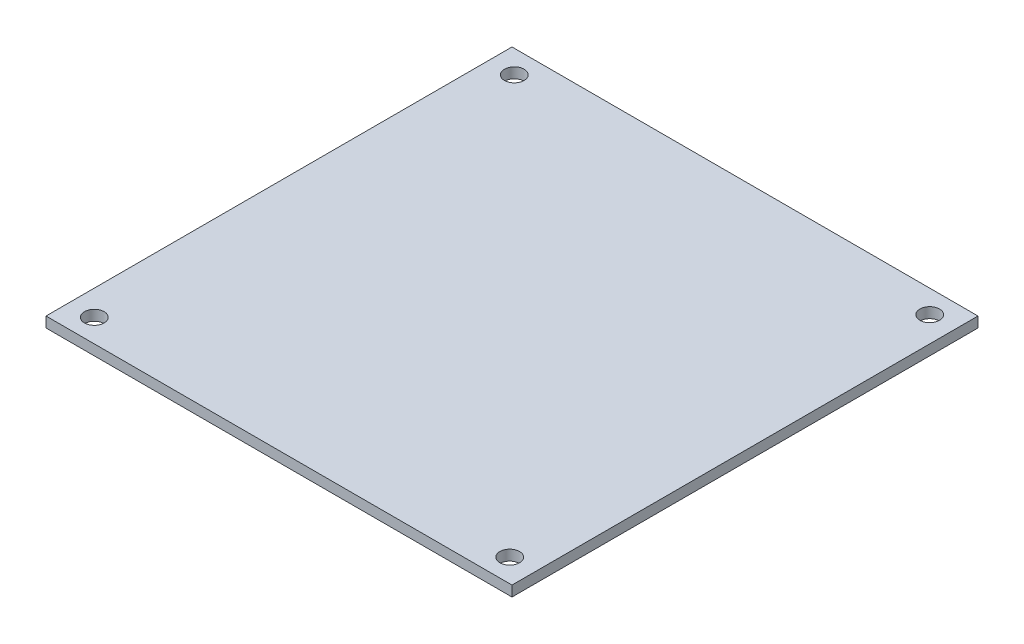
ISO-10303-21;
HEADER;
FILE_DESCRIPTION(('STEP AP214'),'2;1');
FILE_NAME('part.step','',(''),(''),'','','');
FILE_SCHEMA(('AUTOMOTIVE_DESIGN { 1 0 10303 214 1 1 1 1 }'));
ENDSEC;
DATA;
#1=APPLICATION_CONTEXT('core data for automotive mechanical design processes');
#2=APPLICATION_PROTOCOL_DEFINITION('international standard','automotive_design',2000,#1);
#3=PRODUCT_CONTEXT('',#1,'mechanical');
#4=PRODUCT('Part','Part','',(#3));
#5=PRODUCT_RELATED_PRODUCT_CATEGORY('part','',(#4));
#6=PRODUCT_DEFINITION_FORMATION('','',#4);
#7=PRODUCT_DEFINITION_CONTEXT('part definition',#1,'design');
#8=PRODUCT_DEFINITION('design','',#6,#7);
#9=PRODUCT_DEFINITION_SHAPE('','',#8);
#10=(LENGTH_UNIT() NAMED_UNIT(*) SI_UNIT(.MILLI.,.METRE.));
#11=(NAMED_UNIT(*) PLANE_ANGLE_UNIT() SI_UNIT($,.RADIAN.));
#12=(NAMED_UNIT(*) SI_UNIT($,.STERADIAN.) SOLID_ANGLE_UNIT());
#13=UNCERTAINTY_MEASURE_WITH_UNIT(LENGTH_MEASURE(1.E-05),#10,'distance_accuracy_value','');
#14=(GEOMETRIC_REPRESENTATION_CONTEXT(3) GLOBAL_UNCERTAINTY_ASSIGNED_CONTEXT((#13)) GLOBAL_UNIT_ASSIGNED_CONTEXT((#10,
#11,#12)) REPRESENTATION_CONTEXT('',''));
#15=CARTESIAN_POINT('',(0.,0.,0.));
#16=DIRECTION('',(0.,0.,1.));
#17=DIRECTION('',(1.,0.,0.));
#18=AXIS2_PLACEMENT_3D('',#15,#16,#17);
#19=CARTESIAN_POINT('',(35.56,1.5875,35.56));
#20=DIRECTION('',(0.,1.,0.));
#21=DIRECTION('',(0.,0.,1.));
#22=AXIS2_PLACEMENT_3D('',#19,#20,#21);
#23=PLANE('',#22);
#24=CARTESIAN_POINT('',(31.7,1.5875,32.05));
#25=DIRECTION('',(0.,1.,0.));
#26=DIRECTION('',(0.,0.,1.));
#27=AXIS2_PLACEMENT_3D('',#24,#25,#26);
#28=CIRCLE('',#27,1.5);
#29=CARTESIAN_POINT('',(31.7,1.5875,33.55));
#30=VERTEX_POINT('',#29);
#31=EDGE_CURVE('E120',#30,#30,#28,.T.);
#32=ORIENTED_EDGE('',*,*,#31,.F.);
#33=EDGE_LOOP('',(#32));
#34=FACE_BOUND('',#33,.T.);
#35=CARTESIAN_POINT('',(-31.7,1.5875,-32.05));
#36=DIRECTION('',(0.,1.,0.));
#37=DIRECTION('',(0.,0.,1.));
#38=AXIS2_PLACEMENT_3D('',#35,#36,#37);
#39=CIRCLE('',#38,1.5);
#40=CARTESIAN_POINT('',(-31.7,1.5875,-30.55));
#41=VERTEX_POINT('',#40);
#42=EDGE_CURVE('E99',#41,#41,#39,.T.);
#43=ORIENTED_EDGE('',*,*,#42,.F.);
#44=EDGE_LOOP('',(#43));
#45=FACE_BOUND('',#44,.T.);
#46=DIRECTION('',(0.,0.,-1.));
#47=VECTOR('',#46,1.);
#48=CARTESIAN_POINT('',(35.56,1.5875,-35.56));
#49=LINE('',#48,#47);
#50=CARTESIAN_POINT('',(35.56,1.5875,35.56));
#51=VERTEX_POINT('',#50);
#52=CARTESIAN_POINT('',(35.56,1.5875,-35.56));
#53=VERTEX_POINT('',#52);
#54=EDGE_CURVE('E84',#51,#53,#49,.T.);
#55=ORIENTED_EDGE('',*,*,#54,.T.);
#56=DIRECTION('',(-1.,0.,0.));
#57=VECTOR('',#56,1.);
#58=CARTESIAN_POINT('',(-35.56,1.5875,-35.56));
#59=LINE('',#58,#57);
#60=CARTESIAN_POINT('',(-35.56,1.5875,-35.56));
#61=VERTEX_POINT('',#60);
#62=EDGE_CURVE('E79',#53,#61,#59,.T.);
#63=ORIENTED_EDGE('',*,*,#62,.T.);
#64=DIRECTION('',(0.,0.,1.));
#65=VECTOR('',#64,1.);
#66=CARTESIAN_POINT('',(-35.56,1.5875,-35.56));
#67=LINE('',#66,#65);
#68=CARTESIAN_POINT('',(-35.56,1.5875,35.56));
#69=VERTEX_POINT('',#68);
#70=EDGE_CURVE('E82',#61,#69,#67,.T.);
#71=ORIENTED_EDGE('',*,*,#70,.T.);
#72=DIRECTION('',(1.,0.,0.));
#73=VECTOR('',#72,1.);
#74=CARTESIAN_POINT('',(-35.56,1.5875,35.56));
#75=LINE('',#74,#73);
#76=EDGE_CURVE('E49',#69,#51,#75,.T.);
#77=ORIENTED_EDGE('',*,*,#76,.T.);
#78=EDGE_LOOP('',(#55,#63,#71,#77));
#79=FACE_BOUND('',#78,.T.);
#80=CARTESIAN_POINT('',(31.7,1.5875,-32.05));
#81=DIRECTION('',(0.,1.,0.));
#82=DIRECTION('',(0.,0.,-1.));
#83=AXIS2_PLACEMENT_3D('',#80,#81,#82);
#84=CIRCLE('',#83,1.5);
#85=CARTESIAN_POINT('',(31.7,1.5875,-33.55));
#86=VERTEX_POINT('',#85);
#87=EDGE_CURVE('E114',#86,#86,#84,.T.);
#88=ORIENTED_EDGE('',*,*,#87,.F.);
#89=EDGE_LOOP('',(#88));
#90=FACE_BOUND('',#89,.T.);
#91=CARTESIAN_POINT('',(-31.7,1.5875,32.05));
#92=DIRECTION('',(0.,1.,0.));
#93=DIRECTION('',(0.,0.,-1.));
#94=AXIS2_PLACEMENT_3D('',#91,#92,#93);
#95=CIRCLE('',#94,1.5);
#96=CARTESIAN_POINT('',(-31.7,1.5875,30.55));
#97=VERTEX_POINT('',#96);
#98=EDGE_CURVE('E126',#97,#97,#95,.T.);
#99=ORIENTED_EDGE('',*,*,#98,.F.);
#100=EDGE_LOOP('',(#99));
#101=FACE_BOUND('',#100,.T.);
#102=ADVANCED_FACE('F32',(#34,#45,#79,#90,#101),#23,.T.);
#103=CARTESIAN_POINT('',(35.56,0.,35.56));
#104=DIRECTION('',(0.,1.,0.));
#105=DIRECTION('',(0.,0.,1.));
#106=AXIS2_PLACEMENT_3D('',#103,#104,#105);
#107=PLANE('',#106);
#108=CARTESIAN_POINT('',(31.7,0.,32.05));
#109=DIRECTION('',(0.,1.,0.));
#110=DIRECTION('',(0.,0.,1.));
#111=AXIS2_PLACEMENT_3D('',#108,#109,#110);
#112=CIRCLE('',#111,1.5);
#113=CARTESIAN_POINT('',(31.7,0.,33.55));
#114=VERTEX_POINT('',#113);
#115=EDGE_CURVE('E123',#114,#114,#112,.T.);
#116=ORIENTED_EDGE('',*,*,#115,.T.);
#117=EDGE_LOOP('',(#116));
#118=FACE_BOUND('',#117,.T.);
#119=CARTESIAN_POINT('',(-31.7,0.,-32.05));
#120=DIRECTION('',(0.,1.,0.));
#121=DIRECTION('',(0.,0.,1.));
#122=AXIS2_PLACEMENT_3D('',#119,#120,#121);
#123=CIRCLE('',#122,1.5);
#124=CARTESIAN_POINT('',(-31.7,0.,-30.55));
#125=VERTEX_POINT('',#124);
#126=EDGE_CURVE('E111',#125,#125,#123,.T.);
#127=ORIENTED_EDGE('',*,*,#126,.T.);
#128=EDGE_LOOP('',(#127));
#129=FACE_BOUND('',#128,.T.);
#130=DIRECTION('',(0.,0.,-1.));
#131=VECTOR('',#130,1.);
#132=CARTESIAN_POINT('',(35.56,0.,-35.56));
#133=LINE('',#132,#131);
#134=CARTESIAN_POINT('',(35.56,0.,35.56));
#135=VERTEX_POINT('',#134);
#136=CARTESIAN_POINT('',(35.56,0.,-35.56));
#137=VERTEX_POINT('',#136);
#138=EDGE_CURVE('E96',#135,#137,#133,.T.);
#139=ORIENTED_EDGE('',*,*,#138,.F.);
#140=DIRECTION('',(1.,0.,0.));
#141=VECTOR('',#140,1.);
#142=CARTESIAN_POINT('',(-35.56,0.,35.56));
#143=LINE('',#142,#141);
#144=CARTESIAN_POINT('',(-35.56,0.,35.56));
#145=VERTEX_POINT('',#144);
#146=EDGE_CURVE('E72',#145,#135,#143,.T.);
#147=ORIENTED_EDGE('',*,*,#146,.F.);
#148=DIRECTION('',(0.,0.,1.));
#149=VECTOR('',#148,1.);
#150=CARTESIAN_POINT('',(-35.56,0.,-35.56));
#151=LINE('',#150,#149);
#152=CARTESIAN_POINT('',(-35.56,0.,-35.56));
#153=VERTEX_POINT('',#152);
#154=EDGE_CURVE('E66',#153,#145,#151,.T.);
#155=ORIENTED_EDGE('',*,*,#154,.F.);
#156=DIRECTION('',(-1.,0.,0.));
#157=VECTOR('',#156,1.);
#158=CARTESIAN_POINT('',(-35.56,0.,-35.56));
#159=LINE('',#158,#157);
#160=EDGE_CURVE('E88',#137,#153,#159,.T.);
#161=ORIENTED_EDGE('',*,*,#160,.F.);
#162=EDGE_LOOP('',(#139,#147,#155,#161));
#163=FACE_BOUND('',#162,.T.);
#164=CARTESIAN_POINT('',(31.7,0.,-32.05));
#165=DIRECTION('',(0.,1.,0.));
#166=DIRECTION('',(0.,0.,-1.));
#167=AXIS2_PLACEMENT_3D('',#164,#165,#166);
#168=CIRCLE('',#167,1.5);
#169=CARTESIAN_POINT('',(31.7,0.,-33.55));
#170=VERTEX_POINT('',#169);
#171=EDGE_CURVE('E117',#170,#170,#168,.T.);
#172=ORIENTED_EDGE('',*,*,#171,.T.);
#173=EDGE_LOOP('',(#172));
#174=FACE_BOUND('',#173,.T.);
#175=CARTESIAN_POINT('',(-31.7,0.,32.05));
#176=DIRECTION('',(0.,1.,0.));
#177=DIRECTION('',(0.,0.,-1.));
#178=AXIS2_PLACEMENT_3D('',#175,#176,#177);
#179=CIRCLE('',#178,1.5);
#180=CARTESIAN_POINT('',(-31.7,0.,30.55));
#181=VERTEX_POINT('',#180);
#182=EDGE_CURVE('E129',#181,#181,#179,.T.);
#183=ORIENTED_EDGE('',*,*,#182,.T.);
#184=EDGE_LOOP('',(#183));
#185=FACE_BOUND('',#184,.T.);
#186=ADVANCED_FACE('F107',(#118,#129,#163,#174,#185),#107,.F.);
#187=CARTESIAN_POINT('',(35.56,1.5875,-35.56));
#188=DIRECTION('',(-1.,0.,0.));
#189=DIRECTION('',(0.,0.,1.));
#190=AXIS2_PLACEMENT_3D('',#187,#188,#189);
#191=PLANE('',#190);
#192=ORIENTED_EDGE('',*,*,#138,.T.);
#193=DIRECTION('',(0.,-1.,0.));
#194=VECTOR('',#193,1.);
#195=CARTESIAN_POINT('',(35.56,1.5875,-35.56));
#196=LINE('',#195,#194);
#197=EDGE_CURVE('E11',#53,#137,#196,.T.);
#198=ORIENTED_EDGE('',*,*,#197,.F.);
#199=ORIENTED_EDGE('',*,*,#54,.F.);
#200=DIRECTION('',(0.,-1.,0.));
#201=VECTOR('',#200,1.);
#202=CARTESIAN_POINT('',(35.56,1.5875,35.56));
#203=LINE('',#202,#201);
#204=EDGE_CURVE('E92',#51,#135,#203,.T.);
#205=ORIENTED_EDGE('',*,*,#204,.T.);
#206=EDGE_LOOP('',(#192,#198,#199,#205));
#207=FACE_BOUND('',#206,.T.);
#208=ADVANCED_FACE('F34',(#207),#191,.F.);
#209=CARTESIAN_POINT('',(-35.56,1.5875,-35.56));
#210=DIRECTION('',(0.,0.,1.));
#211=DIRECTION('',(1.,0.,0.));
#212=AXIS2_PLACEMENT_3D('',#209,#210,#211);
#213=PLANE('',#212);
#214=ORIENTED_EDGE('',*,*,#160,.T.);
#215=DIRECTION('',(0.,-1.,0.));
#216=VECTOR('',#215,1.);
#217=CARTESIAN_POINT('',(-35.56,1.5875,-35.56));
#218=LINE('',#217,#216);
#219=EDGE_CURVE('E41',#61,#153,#218,.T.);
#220=ORIENTED_EDGE('',*,*,#219,.F.);
#221=ORIENTED_EDGE('',*,*,#62,.F.);
#222=ORIENTED_EDGE('',*,*,#197,.T.);
#223=EDGE_LOOP('',(#214,#220,#221,#222));
#224=FACE_BOUND('',#223,.T.);
#225=ADVANCED_FACE('F87',(#224),#213,.F.);
#226=CARTESIAN_POINT('',(-35.56,1.5875,-35.56));
#227=DIRECTION('',(1.,0.,0.));
#228=DIRECTION('',(0.,0.,-1.));
#229=AXIS2_PLACEMENT_3D('',#226,#227,#228);
#230=PLANE('',#229);
#231=ORIENTED_EDGE('',*,*,#154,.T.);
#232=DIRECTION('',(0.,-1.,0.));
#233=VECTOR('',#232,1.);
#234=CARTESIAN_POINT('',(-35.56,1.5875,35.56));
#235=LINE('',#234,#233);
#236=EDGE_CURVE('E89',#69,#145,#235,.T.);
#237=ORIENTED_EDGE('',*,*,#236,.F.);
#238=ORIENTED_EDGE('',*,*,#70,.F.);
#239=ORIENTED_EDGE('',*,*,#219,.T.);
#240=EDGE_LOOP('',(#231,#237,#238,#239));
#241=FACE_BOUND('',#240,.T.);
#242=ADVANCED_FACE('F90',(#241),#230,.F.);
#243=CARTESIAN_POINT('',(-35.56,1.5875,35.56));
#244=DIRECTION('',(0.,0.,-1.));
#245=DIRECTION('',(-1.,0.,0.));
#246=AXIS2_PLACEMENT_3D('',#243,#244,#245);
#247=PLANE('',#246);
#248=ORIENTED_EDGE('',*,*,#146,.T.);
#249=ORIENTED_EDGE('',*,*,#204,.F.);
#250=ORIENTED_EDGE('',*,*,#76,.F.);
#251=ORIENTED_EDGE('',*,*,#236,.T.);
#252=EDGE_LOOP('',(#248,#249,#250,#251));
#253=FACE_BOUND('',#252,.T.);
#254=ADVANCED_FACE('F104',(#253),#247,.F.);
#255=CARTESIAN_POINT('',(-31.7,1.5875,-32.05));
#256=DIRECTION('',(0.,-1.,0.));
#257=DIRECTION('',(0.,0.,-1.));
#258=AXIS2_PLACEMENT_3D('',#255,#256,#257);
#259=CYLINDRICAL_SURFACE('',#258,1.5);
#260=ORIENTED_EDGE('',*,*,#42,.T.);
#261=EDGE_LOOP('',(#260));
#262=FACE_BOUND('',#261,.T.);
#263=ORIENTED_EDGE('',*,*,#126,.F.);
#264=EDGE_LOOP('',(#263));
#265=FACE_BOUND('',#264,.T.);
#266=ADVANCED_FACE('F149',(#262,#265),#259,.F.);
#267=CARTESIAN_POINT('',(31.7,1.5875,-32.05));
#268=DIRECTION('',(0.,-1.,0.));
#269=DIRECTION('',(0.,0.,-1.));
#270=AXIS2_PLACEMENT_3D('',#267,#268,#269);
#271=CYLINDRICAL_SURFACE('',#270,1.5);
#272=ORIENTED_EDGE('',*,*,#87,.T.);
#273=EDGE_LOOP('',(#272));
#274=FACE_BOUND('',#273,.T.);
#275=ORIENTED_EDGE('',*,*,#171,.F.);
#276=EDGE_LOOP('',(#275));
#277=FACE_BOUND('',#276,.T.);
#278=ADVANCED_FACE('F195',(#274,#277),#271,.F.);
#279=CARTESIAN_POINT('',(31.7,1.5875,32.05));
#280=DIRECTION('',(0.,-1.,0.));
#281=DIRECTION('',(0.,0.,-1.));
#282=AXIS2_PLACEMENT_3D('',#279,#280,#281);
#283=CYLINDRICAL_SURFACE('',#282,1.5);
#284=ORIENTED_EDGE('',*,*,#31,.T.);
#285=EDGE_LOOP('',(#284));
#286=FACE_BOUND('',#285,.T.);
#287=ORIENTED_EDGE('',*,*,#115,.F.);
#288=EDGE_LOOP('',(#287));
#289=FACE_BOUND('',#288,.T.);
#290=ADVANCED_FACE('F203',(#286,#289),#283,.F.);
#291=CARTESIAN_POINT('',(-31.7,1.5875,32.05));
#292=DIRECTION('',(0.,-1.,0.));
#293=DIRECTION('',(0.,0.,-1.));
#294=AXIS2_PLACEMENT_3D('',#291,#292,#293);
#295=CYLINDRICAL_SURFACE('',#294,1.5);
#296=ORIENTED_EDGE('',*,*,#98,.T.);
#297=EDGE_LOOP('',(#296));
#298=FACE_BOUND('',#297,.T.);
#299=ORIENTED_EDGE('',*,*,#182,.F.);
#300=EDGE_LOOP('',(#299));
#301=FACE_BOUND('',#300,.T.);
#302=ADVANCED_FACE('F135',(#298,#301),#295,.F.);
#303=CLOSED_SHELL('',(#102,#186,#208,#225,#242,#254,#266,#278,#290,#302));
#304=MANIFOLD_SOLID_BREP('B2',#303);
#305=ADVANCED_BREP_SHAPE_REPRESENTATION('',(#18,#304),#14);
#306=SHAPE_DEFINITION_REPRESENTATION(#9,#305);
ENDSEC;
END-ISO-10303-21;
